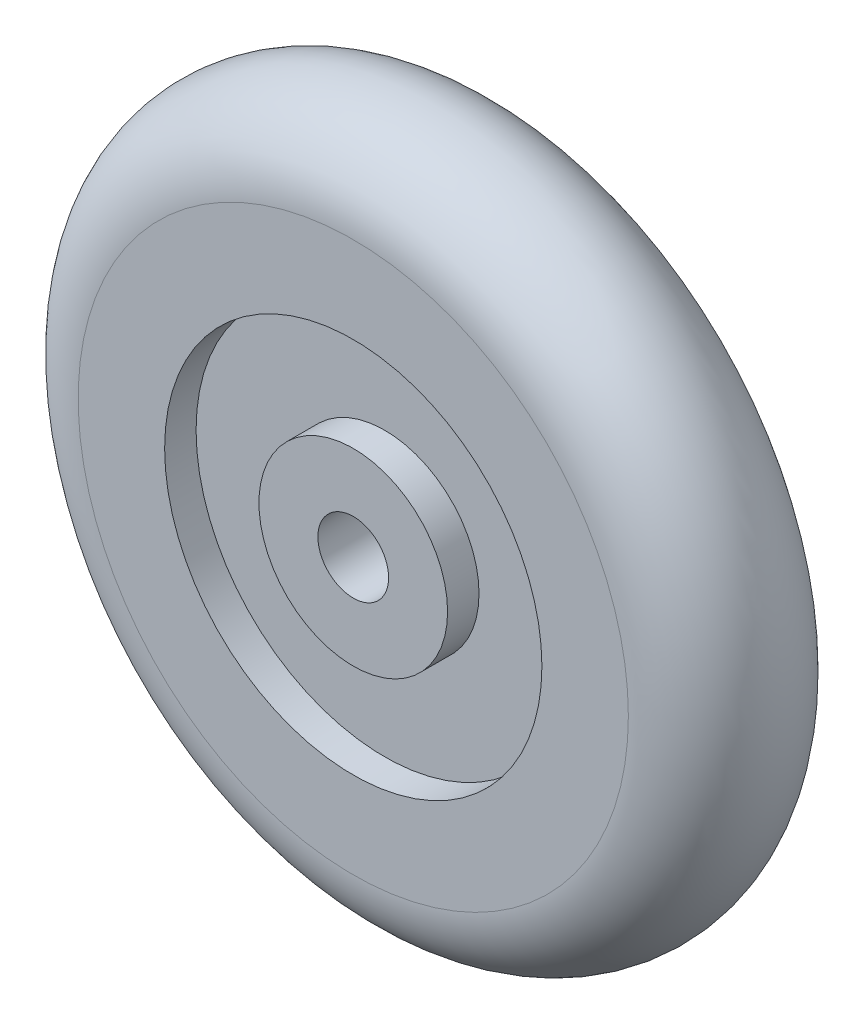
ISO-10303-21;
HEADER;
FILE_DESCRIPTION(('STEP AP214'),'2;1');
FILE_NAME('part.step','',(''),(''),'','','');
FILE_SCHEMA(('AUTOMOTIVE_DESIGN { 1 0 10303 214 1 1 1 1 }'));
ENDSEC;
DATA;
#1=APPLICATION_CONTEXT('core data for automotive mechanical design processes');
#2=APPLICATION_PROTOCOL_DEFINITION('international standard','automotive_design',2000,#1);
#3=PRODUCT_CONTEXT('',#1,'mechanical');
#4=PRODUCT('Part','Part','',(#3));
#5=PRODUCT_RELATED_PRODUCT_CATEGORY('part','',(#4));
#6=PRODUCT_DEFINITION_FORMATION('','',#4);
#7=PRODUCT_DEFINITION_CONTEXT('part definition',#1,'design');
#8=PRODUCT_DEFINITION('design','',#6,#7);
#9=PRODUCT_DEFINITION_SHAPE('','',#8);
#10=(LENGTH_UNIT() NAMED_UNIT(*) SI_UNIT(.MILLI.,.METRE.));
#11=(NAMED_UNIT(*) PLANE_ANGLE_UNIT() SI_UNIT($,.RADIAN.));
#12=(NAMED_UNIT(*) SI_UNIT($,.STERADIAN.) SOLID_ANGLE_UNIT());
#13=UNCERTAINTY_MEASURE_WITH_UNIT(LENGTH_MEASURE(1.E-05),#10,'distance_accuracy_value','');
#14=(GEOMETRIC_REPRESENTATION_CONTEXT(3) GLOBAL_UNCERTAINTY_ASSIGNED_CONTEXT((#13)) GLOBAL_UNIT_ASSIGNED_CONTEXT((#10,
#11,#12)) REPRESENTATION_CONTEXT('',''));
#15=CARTESIAN_POINT('',(0.,0.,0.));
#16=DIRECTION('',(0.,0.,1.));
#17=DIRECTION('',(1.,0.,0.));
#18=AXIS2_PLACEMENT_3D('',#15,#16,#17);
#19=CARTESIAN_POINT('',(0.,-6.00000000000003,4.99999999999991));
#20=DIRECTION('',(0.,0.,0.999999999999997));
#21=DIRECTION('',(1.,0.,0.));
#22=AXIS2_PLACEMENT_3D('',#19,#20,#21);
#23=PLANE('',#22);
#24=CARTESIAN_POINT('',(0.,0.,4.99999999999997));
#25=DIRECTION('',(0.,0.,-0.999999999999997));
#26=DIRECTION('',(-1.,0.,0.));
#27=AXIS2_PLACEMENT_3D('',#24,#25,#26);
#28=CIRCLE('',#27,2.25);
#29=CARTESIAN_POINT('',(-2.25000000000004,0.,4.99999999999997));
#30=VERTEX_POINT('',#29);
#31=EDGE_CURVE('E87',#30,#30,#28,.T.);
#32=ORIENTED_EDGE('',*,*,#31,.T.);
#33=EDGE_LOOP('',(#32));
#34=FACE_BOUND('',#33,.T.);
#35=CARTESIAN_POINT('',(0.,0.,4.99999999999997));
#36=DIRECTION('',(0.,0.,0.999999999999997));
#37=DIRECTION('',(1.,0.,0.));
#38=AXIS2_PLACEMENT_3D('',#35,#36,#37);
#39=CIRCLE('',#38,6.);
#40=CARTESIAN_POINT('',(5.99999999999998,0.,4.99999999999997));
#41=VERTEX_POINT('',#40);
#42=EDGE_CURVE('E10',#41,#41,#39,.T.);
#43=ORIENTED_EDGE('',*,*,#42,.T.);
#44=EDGE_LOOP('',(#43));
#45=FACE_BOUND('',#44,.T.);
#46=ADVANCED_FACE('F38',(#34,#45),#23,.T.);
#47=CARTESIAN_POINT('',(0.,0.,4.99999999999997));
#48=DIRECTION('',(0.,0.,0.999999999999997));
#49=DIRECTION('',(1.,0.,0.));
#50=AXIS2_PLACEMENT_3D('',#47,#48,#49);
#51=CYLINDRICAL_SURFACE('',#50,6.);
#52=CARTESIAN_POINT('',(0.,0.,3.));
#53=DIRECTION('',(0.,0.,0.999999999999997));
#54=DIRECTION('',(1.,0.,0.));
#55=AXIS2_PLACEMENT_3D('',#52,#53,#54);
#56=CIRCLE('',#55,6.);
#57=CARTESIAN_POINT('',(5.99999999999998,0.,3.));
#58=VERTEX_POINT('',#57);
#59=EDGE_CURVE('E45',#58,#58,#56,.T.);
#60=CARTESIAN_POINT('',(5.99999999999998,0.,3.));
#61=CARTESIAN_POINT('',(5.99999999999998,0.,3.02083333333334));
#62=CARTESIAN_POINT('',(5.99999999999998,0.,3.04166666666667));
#63=CARTESIAN_POINT('',(5.99999999999998,0.,3.08333333333333));
#64=CARTESIAN_POINT('',(5.99999999999998,0.,3.10416666666667));
#65=CARTESIAN_POINT('',(5.99999999999998,0.,3.14583333333333));
#66=CARTESIAN_POINT('',(5.99999999999998,0.,3.16666666666667));
#67=CARTESIAN_POINT('',(5.99999999999998,0.,3.20833333333333));
#68=CARTESIAN_POINT('',(5.99999999999998,0.,3.22916666666667));
#69=CARTESIAN_POINT('',(5.99999999999998,0.,3.27083333333333));
#70=CARTESIAN_POINT('',(5.99999999999998,0.,3.29166666666666));
#71=CARTESIAN_POINT('',(5.99999999999998,0.,3.33333333333333));
#72=CARTESIAN_POINT('',(5.99999999999998,0.,3.35416666666666));
#73=CARTESIAN_POINT('',(5.99999999999998,0.,3.39583333333333));
#74=CARTESIAN_POINT('',(5.99999999999998,0.,3.41666666666666));
#75=CARTESIAN_POINT('',(5.99999999999998,0.,3.45833333333333));
#76=CARTESIAN_POINT('',(5.99999999999998,0.,3.47916666666666));
#77=CARTESIAN_POINT('',(5.99999999999998,0.,3.52083333333333));
#78=CARTESIAN_POINT('',(5.99999999999998,0.,3.54166666666666));
#79=CARTESIAN_POINT('',(5.99999999999998,0.,3.58333333333333));
#80=CARTESIAN_POINT('',(5.99999999999998,0.,3.60416666666666));
#81=CARTESIAN_POINT('',(5.99999999999998,0.,3.64583333333333));
#82=CARTESIAN_POINT('',(5.99999999999998,0.,3.66666666666666));
#83=CARTESIAN_POINT('',(5.99999999999998,0.,3.70833333333332));
#84=CARTESIAN_POINT('',(5.99999999999998,0.,3.72916666666666));
#85=CARTESIAN_POINT('',(5.99999999999998,0.,3.77083333333332));
#86=CARTESIAN_POINT('',(5.99999999999998,0.,3.79166666666666));
#87=CARTESIAN_POINT('',(5.99999999999998,0.,3.83333333333332));
#88=CARTESIAN_POINT('',(5.99999999999998,0.,3.85416666666666));
#89=CARTESIAN_POINT('',(5.99999999999998,0.,3.89583333333332));
#90=CARTESIAN_POINT('',(5.99999999999998,0.,3.91666666666665));
#91=CARTESIAN_POINT('',(5.99999999999998,0.,3.95833333333332));
#92=CARTESIAN_POINT('',(5.99999999999998,0.,3.97916666666665));
#93=CARTESIAN_POINT('',(5.99999999999998,0.,4.02083333333332));
#94=CARTESIAN_POINT('',(5.99999999999998,0.,4.04166666666665));
#95=CARTESIAN_POINT('',(5.99999999999998,0.,4.08333333333332));
#96=CARTESIAN_POINT('',(5.99999999999998,0.,4.10416666666665));
#97=CARTESIAN_POINT('',(5.99999999999998,0.,4.14583333333332));
#98=CARTESIAN_POINT('',(5.99999999999998,0.,4.16666666666665));
#99=CARTESIAN_POINT('',(5.99999999999998,0.,4.20833333333332));
#100=CARTESIAN_POINT('',(5.99999999999998,0.,4.22916666666665));
#101=CARTESIAN_POINT('',(5.99999999999998,0.,4.27083333333332));
#102=CARTESIAN_POINT('',(5.99999999999998,0.,4.29166666666665));
#103=CARTESIAN_POINT('',(5.99999999999998,0.,4.33333333333331));
#104=CARTESIAN_POINT('',(5.99999999999998,0.,4.35416666666665));
#105=CARTESIAN_POINT('',(5.99999999999998,0.,4.39583333333331));
#106=CARTESIAN_POINT('',(5.99999999999998,0.,4.41666666666665));
#107=CARTESIAN_POINT('',(5.99999999999998,0.,4.45833333333331));
#108=CARTESIAN_POINT('',(5.99999999999998,0.,4.47916666666664));
#109=CARTESIAN_POINT('',(5.99999999999998,0.,4.52083333333331));
#110=CARTESIAN_POINT('',(5.99999999999998,0.,4.54166666666664));
#111=CARTESIAN_POINT('',(5.99999999999998,0.,4.58333333333331));
#112=CARTESIAN_POINT('',(5.99999999999998,0.,4.60416666666664));
#113=CARTESIAN_POINT('',(5.99999999999998,0.,4.64583333333331));
#114=CARTESIAN_POINT('',(5.99999999999998,0.,4.66666666666664));
#115=CARTESIAN_POINT('',(5.99999999999998,0.,4.70833333333331));
#116=CARTESIAN_POINT('',(5.99999999999998,0.,4.72916666666664));
#117=CARTESIAN_POINT('',(5.99999999999998,0.,4.77083333333331));
#118=CARTESIAN_POINT('',(5.99999999999998,0.,4.79166666666664));
#119=CARTESIAN_POINT('',(5.99999999999998,0.,4.8333333333333));
#120=CARTESIAN_POINT('',(5.99999999999998,0.,4.85416666666664));
#121=CARTESIAN_POINT('',(5.99999999999998,0.,4.8958333333333));
#122=CARTESIAN_POINT('',(5.99999999999998,0.,4.91666666666664));
#123=CARTESIAN_POINT('',(5.99999999999998,0.,4.9583333333333));
#124=CARTESIAN_POINT('',(5.99999999999998,0.,4.97916666666664));
#125=CARTESIAN_POINT('',(5.99999999999998,0.,4.99999999999997));
#126=B_SPLINE_CURVE_WITH_KNOTS('',3,(#60,#61,#62,#63,#64,#65,#66,#67,#68,#69,#70,#71,#72,#73,
#74,#75,#76,#77,#78,#79,#80,#81,#82,#83,#84,#85,#86,#87,#88,#89,#90,#91,#92,#93,#94,#95,#96,#97,
#98,#99,#100,#101,#102,#103,#104,#105,#106,#107,#108,#109,#110,#111,#112,#113,#114,#115,#116,
#117,#118,#119,#120,#121,#122,#123,#124,#125),.UNSPECIFIED.,.F.,.F.,(4,2,2,2,2,2,2,2,2,2,2,2,2,
2,2,2,2,2,2,2,2,2,2,2,2,2,2,2,2,2,2,2,4),(0.,0.0624999999999992,0.124999999999998,
0.187499999999997,0.249999999999996,0.312499999999995,0.374999999999994,0.437499999999993,
0.499999999999992,0.562499999999991,0.62499999999999,0.687499999999988,0.749999999999988,
0.812499999999987,0.874999999999986,0.937499999999984,0.999999999999984,1.06249999999998,
1.12499999999998,1.18749999999998,1.24999999999998,1.31249999999998,1.37499999999998,
1.43749999999998,1.49999999999998,1.56249999999997,1.62499999999997,1.68749999999997,
1.74999999999997,1.81249999999997,1.87499999999997,1.93749999999997,1.99999999999997),.UNSPECIFIED.);
#127=EDGE_CURVE('BSEAM125',#58,#41,#126,.T.);
#128=ORIENTED_EDGE('',*,*,#59,.T.);
#129=ORIENTED_EDGE('',*,*,#42,.F.);
#130=ORIENTED_EDGE('',*,*,#127,.T.);
#131=ORIENTED_EDGE('',*,*,#127,.F.);
#132=EDGE_LOOP('',(#128,#130,#129,#131));
#133=FACE_BOUND('',#132,.T.);
#134=ADVANCED_FACE('F125',(#133),#51,.T.);
#135=CARTESIAN_POINT('',(0.,-6.00000000000008,2.99999999999995));
#136=DIRECTION('',(0.,0.,0.999999999999997));
#137=DIRECTION('',(1.,0.,0.));
#138=AXIS2_PLACEMENT_3D('',#135,#136,#137);
#139=PLANE('',#138);
#140=CARTESIAN_POINT('',(0.,0.,3.));
#141=DIRECTION('',(0.,0.,0.999999999999997));
#142=DIRECTION('',(1.,0.,0.));
#143=AXIS2_PLACEMENT_3D('',#140,#141,#142);
#144=CIRCLE('',#143,12.);
#145=CARTESIAN_POINT('',(12.,0.,3.));
#146=VERTEX_POINT('',#145);
#147=EDGE_CURVE('E51',#146,#146,#144,.T.);
#148=ORIENTED_EDGE('',*,*,#147,.T.);
#149=EDGE_LOOP('',(#148));
#150=FACE_BOUND('',#149,.T.);
#151=ORIENTED_EDGE('',*,*,#59,.F.);
#152=EDGE_LOOP('',(#151));
#153=FACE_BOUND('',#152,.T.);
#154=ADVANCED_FACE('F129',(#150,#153),#139,.T.);
#155=CARTESIAN_POINT('',(0.,0.,4.99999999999997));
#156=DIRECTION('',(0.,0.,0.999999999999997));
#157=DIRECTION('',(1.,0.,0.));
#158=AXIS2_PLACEMENT_3D('',#155,#156,#157);
#159=CYLINDRICAL_SURFACE('',#158,12.);
#160=CARTESIAN_POINT('',(0.,0.,4.99999999999997));
#161=DIRECTION('',(0.,0.,0.999999999999997));
#162=DIRECTION('',(1.,0.,0.));
#163=AXIS2_PLACEMENT_3D('',#160,#161,#162);
#164=CIRCLE('',#163,12.);
#165=CARTESIAN_POINT('',(12.,0.,4.99999999999997));
#166=VERTEX_POINT('',#165);
#167=EDGE_CURVE('E57',#166,#166,#164,.T.);
#168=CARTESIAN_POINT('',(12.,0.,4.99999999999997));
#169=CARTESIAN_POINT('',(12.,0.,4.97916666666664));
#170=CARTESIAN_POINT('',(12.,0.,4.9583333333333));
#171=CARTESIAN_POINT('',(12.,0.,4.91666666666664));
#172=CARTESIAN_POINT('',(12.,0.,4.8958333333333));
#173=CARTESIAN_POINT('',(12.,0.,4.85416666666664));
#174=CARTESIAN_POINT('',(12.,0.,4.8333333333333));
#175=CARTESIAN_POINT('',(12.,0.,4.79166666666664));
#176=CARTESIAN_POINT('',(12.,0.,4.77083333333331));
#177=CARTESIAN_POINT('',(12.,0.,4.72916666666664));
#178=CARTESIAN_POINT('',(12.,0.,4.70833333333331));
#179=CARTESIAN_POINT('',(12.,0.,4.66666666666664));
#180=CARTESIAN_POINT('',(12.,0.,4.64583333333331));
#181=CARTESIAN_POINT('',(12.,0.,4.60416666666664));
#182=CARTESIAN_POINT('',(12.,0.,4.58333333333331));
#183=CARTESIAN_POINT('',(12.,0.,4.54166666666664));
#184=CARTESIAN_POINT('',(12.,0.,4.52083333333331));
#185=CARTESIAN_POINT('',(12.,0.,4.47916666666664));
#186=CARTESIAN_POINT('',(12.,0.,4.45833333333331));
#187=CARTESIAN_POINT('',(12.,0.,4.41666666666665));
#188=CARTESIAN_POINT('',(12.,0.,4.39583333333331));
#189=CARTESIAN_POINT('',(12.,0.,4.35416666666665));
#190=CARTESIAN_POINT('',(12.,0.,4.33333333333331));
#191=CARTESIAN_POINT('',(12.,0.,4.29166666666665));
#192=CARTESIAN_POINT('',(12.,0.,4.27083333333332));
#193=CARTESIAN_POINT('',(12.,0.,4.22916666666665));
#194=CARTESIAN_POINT('',(12.,0.,4.20833333333332));
#195=CARTESIAN_POINT('',(12.,0.,4.16666666666665));
#196=CARTESIAN_POINT('',(12.,0.,4.14583333333332));
#197=CARTESIAN_POINT('',(12.,0.,4.10416666666665));
#198=CARTESIAN_POINT('',(12.,0.,4.08333333333332));
#199=CARTESIAN_POINT('',(12.,0.,4.04166666666665));
#200=CARTESIAN_POINT('',(12.,0.,4.02083333333332));
#201=CARTESIAN_POINT('',(12.,0.,3.97916666666665));
#202=CARTESIAN_POINT('',(12.,0.,3.95833333333332));
#203=CARTESIAN_POINT('',(12.,0.,3.91666666666665));
#204=CARTESIAN_POINT('',(12.,0.,3.89583333333332));
#205=CARTESIAN_POINT('',(12.,0.,3.85416666666666));
#206=CARTESIAN_POINT('',(12.,0.,3.83333333333332));
#207=CARTESIAN_POINT('',(12.,0.,3.79166666666666));
#208=CARTESIAN_POINT('',(12.,0.,3.77083333333332));
#209=CARTESIAN_POINT('',(12.,0.,3.72916666666666));
#210=CARTESIAN_POINT('',(12.,0.,3.70833333333332));
#211=CARTESIAN_POINT('',(12.,0.,3.66666666666666));
#212=CARTESIAN_POINT('',(12.,0.,3.64583333333333));
#213=CARTESIAN_POINT('',(12.,0.,3.60416666666666));
#214=CARTESIAN_POINT('',(12.,0.,3.58333333333333));
#215=CARTESIAN_POINT('',(12.,0.,3.54166666666666));
#216=CARTESIAN_POINT('',(12.,0.,3.52083333333333));
#217=CARTESIAN_POINT('',(12.,0.,3.47916666666666));
#218=CARTESIAN_POINT('',(12.,0.,3.45833333333333));
#219=CARTESIAN_POINT('',(12.,0.,3.41666666666666));
#220=CARTESIAN_POINT('',(12.,0.,3.39583333333333));
#221=CARTESIAN_POINT('',(12.,0.,3.35416666666666));
#222=CARTESIAN_POINT('',(12.,0.,3.33333333333333));
#223=CARTESIAN_POINT('',(12.,0.,3.29166666666666));
#224=CARTESIAN_POINT('',(12.,0.,3.27083333333333));
#225=CARTESIAN_POINT('',(12.,0.,3.22916666666667));
#226=CARTESIAN_POINT('',(12.,0.,3.20833333333333));
#227=CARTESIAN_POINT('',(12.,0.,3.16666666666667));
#228=CARTESIAN_POINT('',(12.,0.,3.14583333333333));
#229=CARTESIAN_POINT('',(12.,0.,3.10416666666667));
#230=CARTESIAN_POINT('',(12.,0.,3.08333333333333));
#231=CARTESIAN_POINT('',(12.,0.,3.04166666666667));
#232=CARTESIAN_POINT('',(12.,0.,3.02083333333334));
#233=CARTESIAN_POINT('',(12.,0.,3.));
#234=B_SPLINE_CURVE_WITH_KNOTS('',3,(#168,#169,#170,#171,#172,#173,#174,#175,#176,#177,#178,
#179,#180,#181,#182,#183,#184,#185,#186,#187,#188,#189,#190,#191,#192,#193,#194,#195,#196,#197,
#198,#199,#200,#201,#202,#203,#204,#205,#206,#207,#208,#209,#210,#211,#212,#213,#214,#215,#216,
#217,#218,#219,#220,#221,#222,#223,#224,#225,#226,#227,#228,#229,#230,#231,#232,#233),
.UNSPECIFIED.,.F.,.F.,(4,2,2,2,2,2,2,2,2,2,2,2,2,2,2,2,2,2,2,2,2,2,2,2,2,2,2,2,2,2,2,2,4),(0.,
0.0624999999999992,0.124999999999998,0.187499999999998,0.249999999999996,0.312499999999995,
0.374999999999994,0.437499999999993,0.499999999999992,0.562499999999991,0.62499999999999,
0.687499999999988,0.749999999999988,0.812499999999987,0.874999999999986,0.937499999999985,
0.999999999999984,1.06249999999998,1.12499999999998,1.18749999999998,1.24999999999998,
1.31249999999998,1.37499999999998,1.43749999999998,1.49999999999998,1.56249999999997,
1.62499999999997,1.68749999999997,1.74999999999997,1.81249999999997,1.87499999999997,
1.93749999999997,1.99999999999997),.UNSPECIFIED.);
#235=EDGE_CURVE('BSEAM133',#166,#146,#234,.T.);
#236=ORIENTED_EDGE('',*,*,#167,.T.);
#237=ORIENTED_EDGE('',*,*,#147,.F.);
#238=ORIENTED_EDGE('',*,*,#235,.T.);
#239=ORIENTED_EDGE('',*,*,#235,.F.);
#240=EDGE_LOOP('',(#236,#238,#237,#239));
#241=FACE_BOUND('',#240,.T.);
#242=ADVANCED_FACE('F133',(#241),#159,.F.);
#243=CARTESIAN_POINT('',(0.,-12.,4.99999999999988));
#244=DIRECTION('',(0.,0.,0.999999999999997));
#245=DIRECTION('',(1.,0.,0.));
#246=AXIS2_PLACEMENT_3D('',#243,#244,#245);
#247=PLANE('',#246);
#248=CARTESIAN_POINT('',(0.,0.,4.99999999999997));
#249=DIRECTION('',(0.,0.,0.999999999999997));
#250=DIRECTION('',(1.,0.,0.));
#251=AXIS2_PLACEMENT_3D('',#248,#249,#250);
#252=CIRCLE('',#251,17.5);
#253=CARTESIAN_POINT('',(17.5,0.,4.99999999999997));
#254=VERTEX_POINT('',#253);
#255=EDGE_CURVE('E63',#254,#254,#252,.T.);
#256=ORIENTED_EDGE('',*,*,#255,.T.);
#257=EDGE_LOOP('',(#256));
#258=FACE_BOUND('',#257,.T.);
#259=ORIENTED_EDGE('',*,*,#167,.F.);
#260=EDGE_LOOP('',(#259));
#261=FACE_BOUND('',#260,.T.);
#262=ADVANCED_FACE('F140',(#258,#261),#247,.T.);
#263=CARTESIAN_POINT('',(0.,0.,0.));
#264=DIRECTION('',(0.,0.,0.999999999999997));
#265=DIRECTION('',(1.,0.,0.));
#266=AXIS2_PLACEMENT_3D('',#263,#264,#265);
#267=TOROIDAL_SURFACE('',#266,17.5,5.);
#268=ORIENTED_EDGE('',*,*,#255,.F.);
#269=EDGE_LOOP('',(#268));
#270=FACE_BOUND('',#269,.T.);
#271=CARTESIAN_POINT('',(0.,0.,-4.99999999999998));
#272=DIRECTION('',(0.,0.,0.999999999999997));
#273=DIRECTION('',(1.,0.,0.));
#274=AXIS2_PLACEMENT_3D('',#271,#272,#273);
#275=CIRCLE('',#274,17.5);
#276=CARTESIAN_POINT('',(17.5,0.,-4.99999999999998));
#277=VERTEX_POINT('',#276);
#278=EDGE_CURVE('E83',#277,#277,#275,.T.);
#279=ORIENTED_EDGE('',*,*,#278,.T.);
#280=EDGE_LOOP('',(#279));
#281=FACE_BOUND('',#280,.T.);
#282=ADVANCED_FACE('F109',(#270,#281),#267,.T.);
#283=CARTESIAN_POINT('',(0.,-6.00000000000007,-5.00000000000003));
#284=DIRECTION('',(0.,0.,-0.999999999999997));
#285=DIRECTION('',(1.,0.,0.));
#286=AXIS2_PLACEMENT_3D('',#283,#284,#285);
#287=PLANE('',#286);
#288=CARTESIAN_POINT('',(0.,0.,-4.99999999999998));
#289=DIRECTION('',(0.,0.,-0.999999999999997));
#290=DIRECTION('',(-1.,0.,0.));
#291=AXIS2_PLACEMENT_3D('',#288,#289,#290);
#292=CIRCLE('',#291,2.25);
#293=CARTESIAN_POINT('',(-2.25000000000004,0.,-4.99999999999998));
#294=VERTEX_POINT('',#293);
#295=EDGE_CURVE('E88',#294,#294,#292,.T.);
#296=ORIENTED_EDGE('',*,*,#295,.F.);
#297=EDGE_LOOP('',(#296));
#298=FACE_BOUND('',#297,.T.);
#299=CARTESIAN_POINT('',(0.,0.,-4.99999999999998));
#300=DIRECTION('',(0.,0.,0.999999999999997));
#301=DIRECTION('',(1.,0.,0.));
#302=AXIS2_PLACEMENT_3D('',#299,#300,#301);
#303=CIRCLE('',#302,6.);
#304=CARTESIAN_POINT('',(5.99999999999998,0.,-4.99999999999998));
#305=VERTEX_POINT('',#304);
#306=EDGE_CURVE('E67',#305,#305,#303,.T.);
#307=ORIENTED_EDGE('',*,*,#306,.F.);
#308=EDGE_LOOP('',(#307));
#309=FACE_BOUND('',#308,.T.);
#310=ADVANCED_FACE('F105',(#298,#309),#287,.T.);
#311=CARTESIAN_POINT('',(0.,0.,-4.99999999999998));
#312=DIRECTION('',(0.,0.,-0.999999999999997));
#313=DIRECTION('',(1.,0.,0.));
#314=AXIS2_PLACEMENT_3D('',#311,#312,#313);
#315=CYLINDRICAL_SURFACE('',#314,6.);
#316=CARTESIAN_POINT('',(0.,0.,-2.99999999999998));
#317=DIRECTION('',(0.,0.,0.999999999999997));
#318=DIRECTION('',(1.,0.,0.));
#319=AXIS2_PLACEMENT_3D('',#316,#317,#318);
#320=CIRCLE('',#319,6.);
#321=CARTESIAN_POINT('',(5.99999999999998,0.,-2.99999999999998));
#322=VERTEX_POINT('',#321);
#323=EDGE_CURVE('E71',#322,#322,#320,.T.);
#324=CARTESIAN_POINT('',(5.99999999999998,0.,-2.99999999999998));
#325=CARTESIAN_POINT('',(5.99999999999998,0.,-3.02083333333331));
#326=CARTESIAN_POINT('',(5.99999999999998,0.,-3.04166666666664));
#327=CARTESIAN_POINT('',(5.99999999999998,0.,-3.08333333333331));
#328=CARTESIAN_POINT('',(5.99999999999998,0.,-3.10416666666664));
#329=CARTESIAN_POINT('',(5.99999999999998,0.,-3.14583333333331));
#330=CARTESIAN_POINT('',(5.99999999999998,0.,-3.16666666666664));
#331=CARTESIAN_POINT('',(5.99999999999998,0.,-3.20833333333331));
#332=CARTESIAN_POINT('',(5.99999999999998,0.,-3.22916666666664));
#333=CARTESIAN_POINT('',(5.99999999999998,0.,-3.27083333333331));
#334=CARTESIAN_POINT('',(5.99999999999998,0.,-3.29166666666664));
#335=CARTESIAN_POINT('',(5.99999999999998,0.,-3.33333333333331));
#336=CARTESIAN_POINT('',(5.99999999999998,0.,-3.35416666666664));
#337=CARTESIAN_POINT('',(5.99999999999998,0.,-3.39583333333331));
#338=CARTESIAN_POINT('',(5.99999999999998,0.,-3.41666666666664));
#339=CARTESIAN_POINT('',(5.99999999999998,0.,-3.45833333333331));
#340=CARTESIAN_POINT('',(5.99999999999998,0.,-3.47916666666664));
#341=CARTESIAN_POINT('',(5.99999999999998,0.,-3.52083333333331));
#342=CARTESIAN_POINT('',(5.99999999999998,0.,-3.54166666666664));
#343=CARTESIAN_POINT('',(5.99999999999998,0.,-3.58333333333331));
#344=CARTESIAN_POINT('',(5.99999999999998,0.,-3.60416666666664));
#345=CARTESIAN_POINT('',(5.99999999999998,0.,-3.64583333333331));
#346=CARTESIAN_POINT('',(5.99999999999998,0.,-3.66666666666664));
#347=CARTESIAN_POINT('',(5.99999999999998,0.,-3.70833333333331));
#348=CARTESIAN_POINT('',(5.99999999999998,0.,-3.72916666666664));
#349=CARTESIAN_POINT('',(5.99999999999998,0.,-3.77083333333331));
#350=CARTESIAN_POINT('',(5.99999999999998,0.,-3.79166666666664));
#351=CARTESIAN_POINT('',(5.99999999999998,0.,-3.83333333333331));
#352=CARTESIAN_POINT('',(5.99999999999998,0.,-3.85416666666664));
#353=CARTESIAN_POINT('',(5.99999999999998,0.,-3.89583333333331));
#354=CARTESIAN_POINT('',(5.99999999999998,0.,-3.91666666666664));
#355=CARTESIAN_POINT('',(5.99999999999998,0.,-3.95833333333331));
#356=CARTESIAN_POINT('',(5.99999999999998,0.,-3.97916666666664));
#357=CARTESIAN_POINT('',(5.99999999999998,0.,-4.02083333333331));
#358=CARTESIAN_POINT('',(5.99999999999998,0.,-4.04166666666664));
#359=CARTESIAN_POINT('',(5.99999999999998,0.,-4.08333333333331));
#360=CARTESIAN_POINT('',(5.99999999999998,0.,-4.10416666666664));
#361=CARTESIAN_POINT('',(5.99999999999998,0.,-4.14583333333331));
#362=CARTESIAN_POINT('',(5.99999999999998,0.,-4.16666666666664));
#363=CARTESIAN_POINT('',(5.99999999999998,0.,-4.20833333333331));
#364=CARTESIAN_POINT('',(5.99999999999998,0.,-4.22916666666664));
#365=CARTESIAN_POINT('',(5.99999999999998,0.,-4.27083333333331));
#366=CARTESIAN_POINT('',(5.99999999999998,0.,-4.29166666666664));
#367=CARTESIAN_POINT('',(5.99999999999998,0.,-4.33333333333331));
#368=CARTESIAN_POINT('',(5.99999999999998,0.,-4.35416666666664));
#369=CARTESIAN_POINT('',(5.99999999999998,0.,-4.39583333333331));
#370=CARTESIAN_POINT('',(5.99999999999998,0.,-4.41666666666664));
#371=CARTESIAN_POINT('',(5.99999999999998,0.,-4.45833333333331));
#372=CARTESIAN_POINT('',(5.99999999999998,0.,-4.47916666666664));
#373=CARTESIAN_POINT('',(5.99999999999998,0.,-4.52083333333331));
#374=CARTESIAN_POINT('',(5.99999999999998,0.,-4.54166666666664));
#375=CARTESIAN_POINT('',(5.99999999999998,0.,-4.58333333333331));
#376=CARTESIAN_POINT('',(5.99999999999998,0.,-4.60416666666664));
#377=CARTESIAN_POINT('',(5.99999999999998,0.,-4.64583333333331));
#378=CARTESIAN_POINT('',(5.99999999999998,0.,-4.66666666666664));
#379=CARTESIAN_POINT('',(5.99999999999998,0.,-4.70833333333331));
#380=CARTESIAN_POINT('',(5.99999999999998,0.,-4.72916666666664));
#381=CARTESIAN_POINT('',(5.99999999999998,0.,-4.77083333333331));
#382=CARTESIAN_POINT('',(5.99999999999998,0.,-4.79166666666664));
#383=CARTESIAN_POINT('',(5.99999999999998,0.,-4.83333333333331));
#384=CARTESIAN_POINT('',(5.99999999999998,0.,-4.85416666666664));
#385=CARTESIAN_POINT('',(5.99999999999998,0.,-4.89583333333331));
#386=CARTESIAN_POINT('',(5.99999999999998,0.,-4.91666666666664));
#387=CARTESIAN_POINT('',(5.99999999999998,0.,-4.95833333333331));
#388=CARTESIAN_POINT('',(5.99999999999998,0.,-4.97916666666664));
#389=CARTESIAN_POINT('',(5.99999999999998,0.,-4.99999999999998));
#390=B_SPLINE_CURVE_WITH_KNOTS('',3,(#324,#325,#326,#327,#328,#329,#330,#331,#332,#333,#334,
#335,#336,#337,#338,#339,#340,#341,#342,#343,#344,#345,#346,#347,#348,#349,#350,#351,#352,#353,
#354,#355,#356,#357,#358,#359,#360,#361,#362,#363,#364,#365,#366,#367,#368,#369,#370,#371,#372,
#373,#374,#375,#376,#377,#378,#379,#380,#381,#382,#383,#384,#385,#386,#387,#388,#389),
.UNSPECIFIED.,.F.,.F.,(4,2,2,2,2,2,2,2,2,2,2,2,2,2,2,2,2,2,2,2,2,2,2,2,2,2,2,2,2,2,2,2,4),(0.,
0.0625000000000001,0.125,0.1875,0.25,0.3125,0.375,0.4375,0.5,0.562500000000001,
0.625000000000001,0.687500000000001,0.750000000000001,0.812500000000001,0.875000000000001,
0.937500000000001,1.,1.0625,1.125,1.1875,1.25,1.3125,1.375,1.4375,1.5,1.5625,1.625,1.6875,1.75,
1.8125,1.875,1.9375,2.),.UNSPECIFIED.);
#391=EDGE_CURVE('BSEAM108',#322,#305,#390,.T.);
#392=ORIENTED_EDGE('',*,*,#323,.F.);
#393=ORIENTED_EDGE('',*,*,#306,.T.);
#394=ORIENTED_EDGE('',*,*,#391,.T.);
#395=ORIENTED_EDGE('',*,*,#391,.F.);
#396=EDGE_LOOP('',(#392,#394,#393,#395));
#397=FACE_BOUND('',#396,.T.);
#398=ADVANCED_FACE('F108',(#397),#315,.T.);
#399=CARTESIAN_POINT('',(0.,-6.00000000000007,-3.00000000000003));
#400=DIRECTION('',(0.,0.,-0.999999999999997));
#401=DIRECTION('',(1.,0.,0.));
#402=AXIS2_PLACEMENT_3D('',#399,#400,#401);
#403=PLANE('',#402);
#404=CARTESIAN_POINT('',(0.,0.,-2.99999999999998));
#405=DIRECTION('',(0.,0.,0.999999999999997));
#406=DIRECTION('',(1.,0.,0.));
#407=AXIS2_PLACEMENT_3D('',#404,#405,#406);
#408=CIRCLE('',#407,12.);
#409=CARTESIAN_POINT('',(12.,0.,-2.99999999999998));
#410=VERTEX_POINT('',#409);
#411=EDGE_CURVE('E75',#410,#410,#408,.T.);
#412=ORIENTED_EDGE('',*,*,#411,.F.);
#413=EDGE_LOOP('',(#412));
#414=FACE_BOUND('',#413,.T.);
#415=ORIENTED_EDGE('',*,*,#323,.T.);
#416=EDGE_LOOP('',(#415));
#417=FACE_BOUND('',#416,.T.);
#418=ADVANCED_FACE('F114',(#414,#417),#403,.T.);
#419=CARTESIAN_POINT('',(0.,0.,-4.99999999999998));
#420=DIRECTION('',(0.,0.,-0.999999999999997));
#421=DIRECTION('',(1.,0.,0.));
#422=AXIS2_PLACEMENT_3D('',#419,#420,#421);
#423=CYLINDRICAL_SURFACE('',#422,12.);
#424=CARTESIAN_POINT('',(0.,0.,-4.99999999999998));
#425=DIRECTION('',(0.,0.,0.999999999999997));
#426=DIRECTION('',(1.,0.,0.));
#427=AXIS2_PLACEMENT_3D('',#424,#425,#426);
#428=CIRCLE('',#427,12.);
#429=CARTESIAN_POINT('',(12.,0.,-4.99999999999998));
#430=VERTEX_POINT('',#429);
#431=EDGE_CURVE('E79',#430,#430,#428,.T.);
#432=CARTESIAN_POINT('',(12.,0.,-4.99999999999998));
#433=CARTESIAN_POINT('',(12.,0.,-4.97916666666664));
#434=CARTESIAN_POINT('',(12.,0.,-4.95833333333331));
#435=CARTESIAN_POINT('',(12.,0.,-4.91666666666664));
#436=CARTESIAN_POINT('',(12.,0.,-4.89583333333331));
#437=CARTESIAN_POINT('',(12.,0.,-4.85416666666664));
#438=CARTESIAN_POINT('',(12.,0.,-4.83333333333331));
#439=CARTESIAN_POINT('',(12.,0.,-4.79166666666664));
#440=CARTESIAN_POINT('',(12.,0.,-4.77083333333331));
#441=CARTESIAN_POINT('',(12.,0.,-4.72916666666664));
#442=CARTESIAN_POINT('',(12.,0.,-4.70833333333331));
#443=CARTESIAN_POINT('',(12.,0.,-4.66666666666664));
#444=CARTESIAN_POINT('',(12.,0.,-4.64583333333331));
#445=CARTESIAN_POINT('',(12.,0.,-4.60416666666664));
#446=CARTESIAN_POINT('',(12.,0.,-4.58333333333331));
#447=CARTESIAN_POINT('',(12.,0.,-4.54166666666664));
#448=CARTESIAN_POINT('',(12.,0.,-4.52083333333331));
#449=CARTESIAN_POINT('',(12.,0.,-4.47916666666664));
#450=CARTESIAN_POINT('',(12.,0.,-4.45833333333331));
#451=CARTESIAN_POINT('',(12.,0.,-4.41666666666664));
#452=CARTESIAN_POINT('',(12.,0.,-4.39583333333331));
#453=CARTESIAN_POINT('',(12.,0.,-4.35416666666664));
#454=CARTESIAN_POINT('',(12.,0.,-4.33333333333331));
#455=CARTESIAN_POINT('',(12.,0.,-4.29166666666664));
#456=CARTESIAN_POINT('',(12.,0.,-4.27083333333331));
#457=CARTESIAN_POINT('',(12.,0.,-4.22916666666664));
#458=CARTESIAN_POINT('',(12.,0.,-4.20833333333331));
#459=CARTESIAN_POINT('',(12.,0.,-4.16666666666664));
#460=CARTESIAN_POINT('',(12.,0.,-4.14583333333331));
#461=CARTESIAN_POINT('',(12.,0.,-4.10416666666664));
#462=CARTESIAN_POINT('',(12.,0.,-4.08333333333331));
#463=CARTESIAN_POINT('',(12.,0.,-4.04166666666664));
#464=CARTESIAN_POINT('',(12.,0.,-4.02083333333331));
#465=CARTESIAN_POINT('',(12.,0.,-3.97916666666664));
#466=CARTESIAN_POINT('',(12.,0.,-3.95833333333331));
#467=CARTESIAN_POINT('',(12.,0.,-3.91666666666664));
#468=CARTESIAN_POINT('',(12.,0.,-3.89583333333331));
#469=CARTESIAN_POINT('',(12.,0.,-3.85416666666664));
#470=CARTESIAN_POINT('',(12.,0.,-3.83333333333331));
#471=CARTESIAN_POINT('',(12.,0.,-3.79166666666664));
#472=CARTESIAN_POINT('',(12.,0.,-3.77083333333331));
#473=CARTESIAN_POINT('',(12.,0.,-3.72916666666664));
#474=CARTESIAN_POINT('',(12.,0.,-3.70833333333331));
#475=CARTESIAN_POINT('',(12.,0.,-3.66666666666664));
#476=CARTESIAN_POINT('',(12.,0.,-3.64583333333331));
#477=CARTESIAN_POINT('',(12.,0.,-3.60416666666664));
#478=CARTESIAN_POINT('',(12.,0.,-3.58333333333331));
#479=CARTESIAN_POINT('',(12.,0.,-3.54166666666664));
#480=CARTESIAN_POINT('',(12.,0.,-3.52083333333331));
#481=CARTESIAN_POINT('',(12.,0.,-3.47916666666664));
#482=CARTESIAN_POINT('',(12.,0.,-3.45833333333331));
#483=CARTESIAN_POINT('',(12.,0.,-3.41666666666664));
#484=CARTESIAN_POINT('',(12.,0.,-3.39583333333331));
#485=CARTESIAN_POINT('',(12.,0.,-3.35416666666664));
#486=CARTESIAN_POINT('',(12.,0.,-3.33333333333331));
#487=CARTESIAN_POINT('',(12.,0.,-3.29166666666664));
#488=CARTESIAN_POINT('',(12.,0.,-3.27083333333331));
#489=CARTESIAN_POINT('',(12.,0.,-3.22916666666664));
#490=CARTESIAN_POINT('',(12.,0.,-3.20833333333331));
#491=CARTESIAN_POINT('',(12.,0.,-3.16666666666664));
#492=CARTESIAN_POINT('',(12.,0.,-3.14583333333331));
#493=CARTESIAN_POINT('',(12.,0.,-3.10416666666664));
#494=CARTESIAN_POINT('',(12.,0.,-3.08333333333331));
#495=CARTESIAN_POINT('',(12.,0.,-3.04166666666664));
#496=CARTESIAN_POINT('',(12.,0.,-3.02083333333331));
#497=CARTESIAN_POINT('',(12.,0.,-2.99999999999998));
#498=B_SPLINE_CURVE_WITH_KNOTS('',3,(#432,#433,#434,#435,#436,#437,#438,#439,#440,#441,#442,
#443,#444,#445,#446,#447,#448,#449,#450,#451,#452,#453,#454,#455,#456,#457,#458,#459,#460,#461,
#462,#463,#464,#465,#466,#467,#468,#469,#470,#471,#472,#473,#474,#475,#476,#477,#478,#479,#480,
#481,#482,#483,#484,#485,#486,#487,#488,#489,#490,#491,#492,#493,#494,#495,#496,#497),
.UNSPECIFIED.,.F.,.F.,(4,2,2,2,2,2,2,2,2,2,2,2,2,2,2,2,2,2,2,2,2,2,2,2,2,2,2,2,2,2,2,2,4),(0.,
0.0625000000000009,0.125000000000001,0.187500000000001,0.250000000000001,0.312500000000001,
0.375000000000001,0.437500000000001,0.500000000000001,0.562500000000001,0.625000000000001,
0.687500000000001,0.750000000000002,0.812500000000002,0.875000000000002,0.937500000000002,1.,
1.0625,1.125,1.1875,1.25,1.3125,1.375,1.4375,1.5,1.5625,1.625,1.6875,1.75,1.8125,1.875,1.9375,
2.),.UNSPECIFIED.);
#499=EDGE_CURVE('BSEAM120',#430,#410,#498,.T.);
#500=ORIENTED_EDGE('',*,*,#431,.F.);
#501=ORIENTED_EDGE('',*,*,#411,.T.);
#502=ORIENTED_EDGE('',*,*,#499,.T.);
#503=ORIENTED_EDGE('',*,*,#499,.F.);
#504=EDGE_LOOP('',(#500,#502,#501,#503));
#505=FACE_BOUND('',#504,.T.);
#506=ADVANCED_FACE('F120',(#505),#423,.F.);
#507=CARTESIAN_POINT('',(0.,-12.0000000000001,-5.00000000000003));
#508=DIRECTION('',(0.,0.,-0.999999999999997));
#509=DIRECTION('',(1.,0.,0.));
#510=AXIS2_PLACEMENT_3D('',#507,#508,#509);
#511=PLANE('',#510);
#512=ORIENTED_EDGE('',*,*,#278,.F.);
#513=EDGE_LOOP('',(#512));
#514=FACE_BOUND('',#513,.T.);
#515=ORIENTED_EDGE('',*,*,#431,.T.);
#516=EDGE_LOOP('',(#515));
#517=FACE_BOUND('',#516,.T.);
#518=ADVANCED_FACE('F101',(#514,#517),#511,.T.);
#519=CARTESIAN_POINT('',(0.,0.,4.99999999999997));
#520=DIRECTION('',(0.,0.,-0.999999999999997));
#521=DIRECTION('',(-1.,0.,0.));
#522=AXIS2_PLACEMENT_3D('',#519,#520,#521);
#523=CYLINDRICAL_SURFACE('',#522,2.25);
#524=CARTESIAN_POINT('',(-2.25000000000004,0.,4.99999999999997));
#525=CARTESIAN_POINT('',(-2.25000000000004,0.,4.8958333333333));
#526=CARTESIAN_POINT('',(-2.25000000000004,0.,4.79166666666664));
#527=CARTESIAN_POINT('',(-2.25000000000004,0.,4.58333333333331));
#528=CARTESIAN_POINT('',(-2.25000000000004,0.,4.47916666666664));
#529=CARTESIAN_POINT('',(-2.25000000000004,0.,4.27083333333331));
#530=CARTESIAN_POINT('',(-2.25000000000004,0.,4.16666666666664));
#531=CARTESIAN_POINT('',(-2.25000000000004,0.,3.95833333333331));
#532=CARTESIAN_POINT('',(-2.25000000000004,0.,3.85416666666664));
#533=CARTESIAN_POINT('',(-2.25000000000004,0.,3.64583333333331));
#534=CARTESIAN_POINT('',(-2.25000000000004,0.,3.54166666666664));
#535=CARTESIAN_POINT('',(-2.25000000000004,0.,3.33333333333331));
#536=CARTESIAN_POINT('',(-2.25000000000004,0.,3.22916666666665));
#537=CARTESIAN_POINT('',(-2.25000000000004,0.,3.02083333333331));
#538=CARTESIAN_POINT('',(-2.25000000000004,0.,2.91666666666665));
#539=CARTESIAN_POINT('',(-2.25000000000004,0.,2.70833333333332));
#540=CARTESIAN_POINT('',(-2.25000000000004,0.,2.60416666666665));
#541=CARTESIAN_POINT('',(-2.25000000000004,0.,2.39583333333332));
#542=CARTESIAN_POINT('',(-2.25000000000004,0.,2.29166666666665));
#543=CARTESIAN_POINT('',(-2.25000000000004,0.,2.08333333333332));
#544=CARTESIAN_POINT('',(-2.25000000000004,0.,1.97916666666665));
#545=CARTESIAN_POINT('',(-2.25000000000004,0.,1.77083333333332));
#546=CARTESIAN_POINT('',(-2.25000000000004,0.,1.66666666666666));
#547=CARTESIAN_POINT('',(-2.25000000000004,0.,1.45833333333332));
#548=CARTESIAN_POINT('',(-2.25000000000004,0.,1.35416666666666));
#549=CARTESIAN_POINT('',(-2.25000000000004,0.,1.14583333333332));
#550=CARTESIAN_POINT('',(-2.25000000000004,0.,1.04166666666666));
#551=CARTESIAN_POINT('',(-2.25000000000004,0.,0.833333333333326));
#552=CARTESIAN_POINT('',(-2.25000000000004,0.,0.72916666666666));
#553=CARTESIAN_POINT('',(-2.25000000000004,0.,0.520833333333328));
#554=CARTESIAN_POINT('',(-2.25000000000004,0.,0.416666666666662));
#555=CARTESIAN_POINT('',(-2.25000000000004,0.,0.20833333333333));
#556=CARTESIAN_POINT('',(-2.25000000000004,0.,0.104166666666664));
#557=CARTESIAN_POINT('',(-2.25000000000004,0.,-0.104166666666669));
#558=CARTESIAN_POINT('',(-2.25000000000004,0.,-0.208333333333335));
#559=CARTESIAN_POINT('',(-2.25000000000004,0.,-0.416666666666667));
#560=CARTESIAN_POINT('',(-2.25000000000004,0.,-0.520833333333333));
#561=CARTESIAN_POINT('',(-2.25000000000004,0.,-0.729166666666665));
#562=CARTESIAN_POINT('',(-2.25000000000004,0.,-0.833333333333331));
#563=CARTESIAN_POINT('',(-2.25000000000004,0.,-1.04166666666666));
#564=CARTESIAN_POINT('',(-2.25000000000004,0.,-1.14583333333333));
#565=CARTESIAN_POINT('',(-2.25000000000004,0.,-1.35416666666666));
#566=CARTESIAN_POINT('',(-2.25000000000004,0.,-1.45833333333333));
#567=CARTESIAN_POINT('',(-2.25000000000004,0.,-1.66666666666666));
#568=CARTESIAN_POINT('',(-2.25000000000004,0.,-1.77083333333333));
#569=CARTESIAN_POINT('',(-2.25000000000004,0.,-1.97916666666666));
#570=CARTESIAN_POINT('',(-2.25000000000004,0.,-2.08333333333332));
#571=CARTESIAN_POINT('',(-2.25000000000004,0.,-2.29166666666666));
#572=CARTESIAN_POINT('',(-2.25000000000004,0.,-2.39583333333332));
#573=CARTESIAN_POINT('',(-2.25000000000004,0.,-2.60416666666665));
#574=CARTESIAN_POINT('',(-2.25000000000004,0.,-2.70833333333332));
#575=CARTESIAN_POINT('',(-2.25000000000004,0.,-2.91666666666665));
#576=CARTESIAN_POINT('',(-2.25000000000004,0.,-3.02083333333332));
#577=CARTESIAN_POINT('',(-2.25000000000004,0.,-3.22916666666665));
#578=CARTESIAN_POINT('',(-2.25000000000004,0.,-3.33333333333332));
#579=CARTESIAN_POINT('',(-2.25000000000004,0.,-3.54166666666665));
#580=CARTESIAN_POINT('',(-2.25000000000004,0.,-3.64583333333332));
#581=CARTESIAN_POINT('',(-2.25000000000004,0.,-3.85416666666665));
#582=CARTESIAN_POINT('',(-2.25000000000004,0.,-3.95833333333331));
#583=CARTESIAN_POINT('',(-2.25000000000004,0.,-4.16666666666665));
#584=CARTESIAN_POINT('',(-2.25000000000004,0.,-4.27083333333331));
#585=CARTESIAN_POINT('',(-2.25000000000004,0.,-4.47916666666664));
#586=CARTESIAN_POINT('',(-2.25000000000004,0.,-4.58333333333331));
#587=CARTESIAN_POINT('',(-2.25000000000004,0.,-4.79166666666664));
#588=CARTESIAN_POINT('',(-2.25000000000004,0.,-4.89583333333331));
#589=CARTESIAN_POINT('',(-2.25000000000004,0.,-4.99999999999998));
#590=B_SPLINE_CURVE_WITH_KNOTS('',3,(#524,#525,#526,#527,#528,#529,#530,#531,#532,#533,#534,
#535,#536,#537,#538,#539,#540,#541,#542,#543,#544,#545,#546,#547,#548,#549,#550,#551,#552,#553,
#554,#555,#556,#557,#558,#559,#560,#561,#562,#563,#564,#565,#566,#567,#568,#569,#570,#571,#572,
#573,#574,#575,#576,#577,#578,#579,#580,#581,#582,#583,#584,#585,#586,#587,#588,#589),
.UNSPECIFIED.,.F.,.F.,(4,2,2,2,2,2,2,2,2,2,2,2,2,2,2,2,2,2,2,2,2,2,2,2,2,2,2,2,2,2,2,2,4),(0.,
0.312499999999998,0.624999999999996,0.937499999999994,1.24999999999999,1.56249999999999,
1.87499999999999,2.18749999999999,2.49999999999999,2.81249999999998,3.12499999999998,
3.43749999999998,3.74999999999998,4.06249999999998,4.37499999999998,4.68749999999997,
4.99999999999997,5.31249999999997,5.62499999999997,5.93749999999997,6.24999999999996,
6.56249999999996,6.87499999999996,7.18749999999996,7.49999999999996,7.81249999999996,
8.12499999999996,8.43749999999995,8.74999999999995,9.06249999999995,9.37499999999995,
9.68749999999995,9.99999999999994),.UNSPECIFIED.);
#591=EDGE_CURVE('BSEAM98',#30,#294,#590,.T.);
#592=ORIENTED_EDGE('',*,*,#31,.F.);
#593=ORIENTED_EDGE('',*,*,#295,.T.);
#594=ORIENTED_EDGE('',*,*,#591,.T.);
#595=ORIENTED_EDGE('',*,*,#591,.F.);
#596=EDGE_LOOP('',(#592,#594,#593,#595));
#597=FACE_BOUND('',#596,.T.);
#598=ADVANCED_FACE('F98',(#597),#523,.F.);
#599=CLOSED_SHELL('',(#46,#134,#154,#242,#262,#282,#310,#398,#418,#506,#518,#598));
#600=MANIFOLD_SOLID_BREP('B2',#599);
#601=ADVANCED_BREP_SHAPE_REPRESENTATION('',(#18,#600),#14);
#602=SHAPE_DEFINITION_REPRESENTATION(#9,#601);
ENDSEC;
END-ISO-10303-21;
